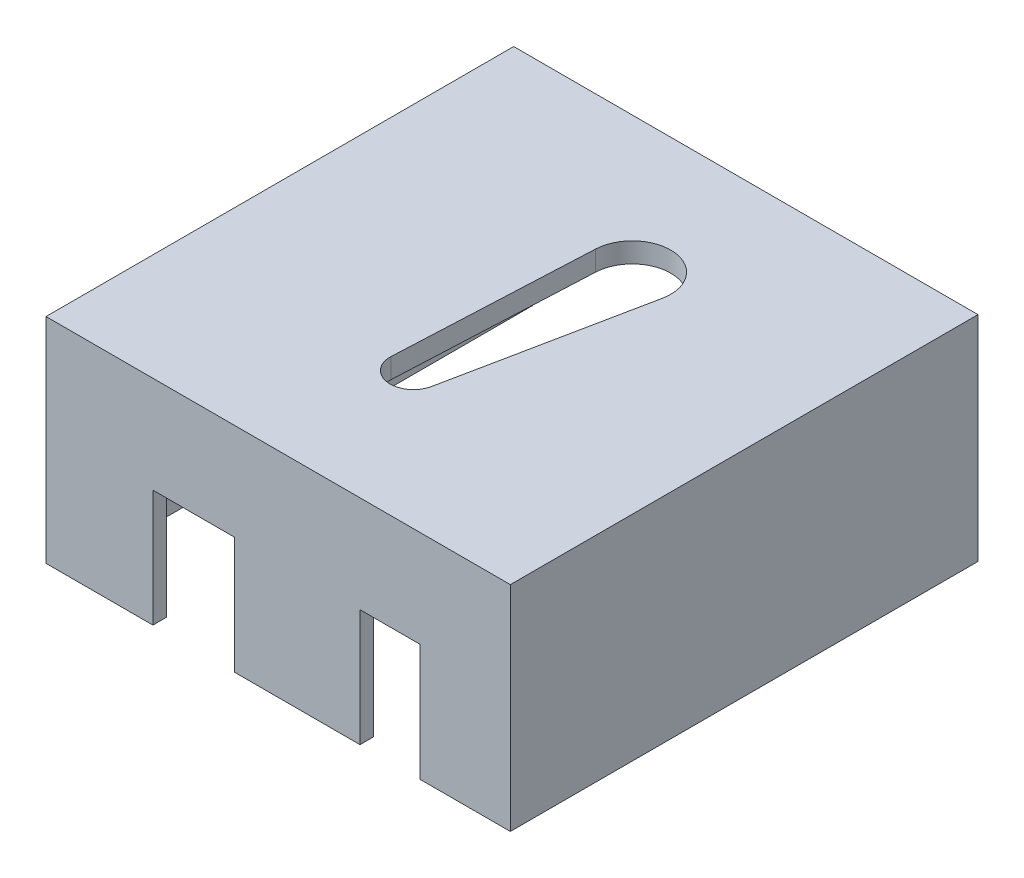
ISO-10303-21;
HEADER;
FILE_DESCRIPTION(('STEP AP214'),'2;1');
FILE_NAME('part.step','',(''),(''),'','','');
FILE_SCHEMA(('AUTOMOTIVE_DESIGN { 1 0 10303 214 1 1 1 1 }'));
ENDSEC;
DATA;
#1=APPLICATION_CONTEXT('core data for automotive mechanical design processes');
#2=APPLICATION_PROTOCOL_DEFINITION('international standard','automotive_design',2000,#1);
#3=PRODUCT_CONTEXT('',#1,'mechanical');
#4=PRODUCT('Part','Part','',(#3));
#5=PRODUCT_RELATED_PRODUCT_CATEGORY('part','',(#4));
#6=PRODUCT_DEFINITION_FORMATION('','',#4);
#7=PRODUCT_DEFINITION_CONTEXT('part definition',#1,'design');
#8=PRODUCT_DEFINITION('design','',#6,#7);
#9=PRODUCT_DEFINITION_SHAPE('','',#8);
#10=(LENGTH_UNIT() NAMED_UNIT(*) SI_UNIT(.MILLI.,.METRE.));
#11=(NAMED_UNIT(*) PLANE_ANGLE_UNIT() SI_UNIT($,.RADIAN.));
#12=(NAMED_UNIT(*) SI_UNIT($,.STERADIAN.) SOLID_ANGLE_UNIT());
#13=UNCERTAINTY_MEASURE_WITH_UNIT(LENGTH_MEASURE(1.E-05),#10,'distance_accuracy_value','');
#14=(GEOMETRIC_REPRESENTATION_CONTEXT(3) GLOBAL_UNCERTAINTY_ASSIGNED_CONTEXT((#13)) GLOBAL_UNIT_ASSIGNED_CONTEXT((#10,
#11,#12)) REPRESENTATION_CONTEXT('',''));
#15=CARTESIAN_POINT('',(0.,0.,0.));
#16=DIRECTION('',(0.,0.,1.));
#17=DIRECTION('',(1.,0.,0.));
#18=AXIS2_PLACEMENT_3D('',#15,#16,#17);
#19=CARTESIAN_POINT('',(0.,-29.464,0.));
#20=DIRECTION('',(0.,-1.,0.));
#21=DIRECTION('',(0.,0.,-1.));
#22=AXIS2_PLACEMENT_3D('',#19,#20,#21);
#23=PLANE('',#22);
#24=DIRECTION('',(0.,0.,1.));
#25=VECTOR('',#24,1.);
#26=CARTESIAN_POINT('',(-6.604,-29.464,0.));
#27=LINE('',#26,#25);
#28=CARTESIAN_POINT('',(-6.604,-29.464,-2.03200000000001));
#29=VERTEX_POINT('',#28);
#30=CARTESIAN_POINT('',(-6.604,-29.464,0.));
#31=VERTEX_POINT('',#30);
#32=EDGE_CURVE('E11',#29,#31,#27,.T.);
#33=ORIENTED_EDGE('',*,*,#32,.F.);
#34=DIRECTION('',(1.,0.,0.));
#35=VECTOR('',#34,1.);
#36=CARTESIAN_POINT('',(0.,-29.464,-2.032));
#37=LINE('',#36,#35);
#38=CARTESIAN_POINT('',(12.446,-29.464,-2.03200000000001));
#39=VERTEX_POINT('',#38);
#40=EDGE_CURVE('E402',#29,#39,#37,.T.);
#41=ORIENTED_EDGE('',*,*,#40,.T.);
#42=DIRECTION('',(0.,0.,-1.));
#43=VECTOR('',#42,1.);
#44=CARTESIAN_POINT('',(12.446,-29.464,0.));
#45=LINE('',#44,#43);
#46=CARTESIAN_POINT('',(12.446,-29.464,0.));
#47=VERTEX_POINT('',#46);
#48=EDGE_CURVE('E426',#47,#39,#45,.T.);
#49=ORIENTED_EDGE('',*,*,#48,.F.);
#50=DIRECTION('',(1.,0.,0.));
#51=VECTOR('',#50,1.);
#52=CARTESIAN_POINT('',(0.,-29.464,0.));
#53=LINE('',#52,#51);
#54=EDGE_CURVE('E410',#31,#47,#53,.T.);
#55=ORIENTED_EDGE('',*,*,#54,.F.);
#56=EDGE_LOOP('',(#33,#41,#49,#55));
#57=FACE_BOUND('',#56,.T.);
#58=ADVANCED_FACE('F33',(#57),#23,.T.);
#59=DIRECTION('',(0.,0.,1.));
#60=VECTOR('',#59,1.);
#61=CARTESIAN_POINT('',(21.59,-29.464,0.));
#62=LINE('',#61,#60);
#63=CARTESIAN_POINT('',(21.59,-29.464,-2.03200000000001));
#64=VERTEX_POINT('',#63);
#65=CARTESIAN_POINT('',(21.59,-29.464,0.));
#66=VERTEX_POINT('',#65);
#67=EDGE_CURVE('E428',#64,#66,#62,.T.);
#68=ORIENTED_EDGE('',*,*,#67,.F.);
#69=CARTESIAN_POINT('',(32.258,-29.464,-2.032));
#70=VERTEX_POINT('',#69);
#71=EDGE_CURVE('E403',#64,#70,#37,.T.);
#72=ORIENTED_EDGE('',*,*,#71,.T.);
#73=DIRECTION('',(0.,0.,1.));
#74=VECTOR('',#73,1.);
#75=CARTESIAN_POINT('',(32.258,-29.464,-71.12));
#76=LINE('',#75,#74);
#77=CARTESIAN_POINT('',(32.258,-29.464,-71.12));
#78=VERTEX_POINT('',#77);
#79=EDGE_CURVE('E384',#78,#70,#76,.T.);
#80=ORIENTED_EDGE('',*,*,#79,.F.);
#81=DIRECTION('',(-1.,0.,0.));
#82=VECTOR('',#81,1.);
#83=CARTESIAN_POINT('',(35.306,-29.464,-71.12));
#84=LINE('',#83,#82);
#85=CARTESIAN_POINT('',(35.306,-29.464,-71.12));
#86=VERTEX_POINT('',#85);
#87=EDGE_CURVE('E381',#86,#78,#84,.T.);
#88=ORIENTED_EDGE('',*,*,#87,.F.);
#89=DIRECTION('',(0.,0.,-1.));
#90=VECTOR('',#89,1.);
#91=CARTESIAN_POINT('',(35.306,-29.464,0.));
#92=LINE('',#91,#90);
#93=CARTESIAN_POINT('',(35.306,-29.464,0.));
#94=VERTEX_POINT('',#93);
#95=EDGE_CURVE('E401',#94,#86,#92,.T.);
#96=ORIENTED_EDGE('',*,*,#95,.F.);
#97=EDGE_CURVE('E406',#66,#94,#53,.T.);
#98=ORIENTED_EDGE('',*,*,#97,.F.);
#99=EDGE_LOOP('',(#68,#72,#80,#88,#96,#98));
#100=FACE_BOUND('',#99,.T.);
#101=ADVANCED_FACE('F490',(#100),#23,.T.);
#102=CARTESIAN_POINT('',(0.,3.048,-71.12));
#103=DIRECTION('',(0.,0.,-1.));
#104=DIRECTION('',(-1.,0.,0.));
#105=AXIS2_PLACEMENT_3D('',#102,#103,#104);
#106=PLANE('',#105);
#107=DIRECTION('',(0.,-1.,0.));
#108=VECTOR('',#107,1.);
#109=CARTESIAN_POINT('',(-33.274,-9.906,-71.12));
#110=LINE('',#109,#108);
#111=CARTESIAN_POINT('',(-33.274,-9.906,-71.12));
#112=VERTEX_POINT('',#111);
#113=CARTESIAN_POINT('',(-33.274,-11.811,-71.12));
#114=VERTEX_POINT('',#113);
#115=EDGE_CURVE('E311',#112,#114,#110,.T.);
#116=ORIENTED_EDGE('',*,*,#115,.T.);
#117=DIRECTION('',(1.,0.,0.));
#118=VECTOR('',#117,1.);
#119=CARTESIAN_POINT('',(-33.274,-11.811,-71.12));
#120=LINE('',#119,#118);
#121=CARTESIAN_POINT('',(-32.258,-11.811,-71.12));
#122=VERTEX_POINT('',#121);
#123=EDGE_CURVE('E301',#114,#122,#120,.T.);
#124=ORIENTED_EDGE('',*,*,#123,.T.);
#125=DIRECTION('',(0.,1.,0.));
#126=VECTOR('',#125,1.);
#127=CARTESIAN_POINT('',(-32.258,-29.464,-71.12));
#128=LINE('',#127,#126);
#129=CARTESIAN_POINT('',(-32.258,-29.464,-71.12));
#130=VERTEX_POINT('',#129);
#131=EDGE_CURVE('E336',#130,#122,#128,.T.);
#132=ORIENTED_EDGE('',*,*,#131,.F.);
#133=DIRECTION('',(1.,0.,0.));
#134=VECTOR('',#133,1.);
#135=CARTESIAN_POINT('',(-35.306,-29.464,-71.12));
#136=LINE('',#135,#134);
#137=CARTESIAN_POINT('',(-35.306,-29.464,-71.12));
#138=VERTEX_POINT('',#137);
#139=EDGE_CURVE('E327',#138,#130,#136,.T.);
#140=ORIENTED_EDGE('',*,*,#139,.F.);
#141=DIRECTION('',(0.,-1.,0.));
#142=VECTOR('',#141,1.);
#143=CARTESIAN_POINT('',(-35.306,3.048,-71.12));
#144=LINE('',#143,#142);
#145=CARTESIAN_POINT('',(-35.306,3.048,-71.12));
#146=VERTEX_POINT('',#145);
#147=EDGE_CURVE('E351',#146,#138,#144,.T.);
#148=ORIENTED_EDGE('',*,*,#147,.F.);
#149=DIRECTION('',(1.,0.,0.));
#150=VECTOR('',#149,1.);
#151=CARTESIAN_POINT('',(0.,3.048,-71.12));
#152=LINE('',#151,#150);
#153=CARTESIAN_POINT('',(35.306,3.048,-71.12));
#154=VERTEX_POINT('',#153);
#155=EDGE_CURVE('E417',#146,#154,#152,.T.);
#156=ORIENTED_EDGE('',*,*,#155,.T.);
#157=DIRECTION('',(0.,-1.,0.));
#158=VECTOR('',#157,1.);
#159=CARTESIAN_POINT('',(35.306,3.048,-71.12));
#160=LINE('',#159,#158);
#161=EDGE_CURVE('E420',#154,#86,#160,.T.);
#162=ORIENTED_EDGE('',*,*,#161,.T.);
#163=ORIENTED_EDGE('',*,*,#87,.T.);
#164=DIRECTION('',(0.,1.,0.));
#165=VECTOR('',#164,1.);
#166=CARTESIAN_POINT('',(32.258,-29.464,-71.12));
#167=LINE('',#166,#165);
#168=CARTESIAN_POINT('',(32.258,-11.811,-71.12));
#169=VERTEX_POINT('',#168);
#170=EDGE_CURVE('E395',#78,#169,#167,.T.);
#171=ORIENTED_EDGE('',*,*,#170,.T.);
#172=DIRECTION('',(-1.,0.,0.));
#173=VECTOR('',#172,1.);
#174=CARTESIAN_POINT('',(33.274,-11.811,-71.12));
#175=LINE('',#174,#173);
#176=CARTESIAN_POINT('',(33.274,-11.811,-71.12));
#177=VERTEX_POINT('',#176);
#178=EDGE_CURVE('E359',#177,#169,#175,.T.);
#179=ORIENTED_EDGE('',*,*,#178,.F.);
#180=DIRECTION('',(0.,-1.,0.));
#181=VECTOR('',#180,1.);
#182=CARTESIAN_POINT('',(33.274,-9.906,-71.12));
#183=LINE('',#182,#181);
#184=CARTESIAN_POINT('',(33.274,-9.906,-71.12));
#185=VERTEX_POINT('',#184);
#186=EDGE_CURVE('E354',#185,#177,#183,.T.);
#187=ORIENTED_EDGE('',*,*,#186,.F.);
#188=DIRECTION('',(1.,0.,0.));
#189=VECTOR('',#188,1.);
#190=CARTESIAN_POINT('',(33.274,-9.906,-71.12));
#191=LINE('',#190,#189);
#192=CARTESIAN_POINT('',(32.258,-9.906,-71.12));
#193=VERTEX_POINT('',#192);
#194=EDGE_CURVE('E355',#193,#185,#191,.T.);
#195=ORIENTED_EDGE('',*,*,#194,.F.);
#196=CARTESIAN_POINT('',(32.258,0.,-71.12));
#197=VERTEX_POINT('',#196);
#198=EDGE_CURVE('E387',#193,#197,#167,.T.);
#199=ORIENTED_EDGE('',*,*,#198,.T.);
#200=DIRECTION('',(1.,0.,0.));
#201=VECTOR('',#200,1.);
#202=CARTESIAN_POINT('',(0.,0.,-71.12));
#203=LINE('',#202,#201);
#204=CARTESIAN_POINT('',(-32.258,0.,-71.12));
#205=VERTEX_POINT('',#204);
#206=EDGE_CURVE('E409',#205,#197,#203,.T.);
#207=ORIENTED_EDGE('',*,*,#206,.F.);
#208=CARTESIAN_POINT('',(-32.258,-9.906,-71.12));
#209=VERTEX_POINT('',#208);
#210=EDGE_CURVE('E340',#209,#205,#128,.T.);
#211=ORIENTED_EDGE('',*,*,#210,.F.);
#212=DIRECTION('',(-1.,0.,0.));
#213=VECTOR('',#212,1.);
#214=CARTESIAN_POINT('',(-33.274,-9.906,-71.12));
#215=LINE('',#214,#213);
#216=EDGE_CURVE('E306',#209,#112,#215,.T.);
#217=ORIENTED_EDGE('',*,*,#216,.T.);
#218=EDGE_LOOP('',(#116,#124,#132,#140,#148,#156,#162,#163,#171,#179,#187,#195,#199,#207,#211,#217));
#219=FACE_BOUND('',#218,.T.);
#220=ADVANCED_FACE('F465',(#219),#106,.T.);
#221=CARTESIAN_POINT('',(-32.258,-29.464,-71.12));
#222=DIRECTION('',(-1.,0.,0.));
#223=DIRECTION('',(0.,0.,1.));
#224=AXIS2_PLACEMENT_3D('',#221,#222,#223);
#225=PLANE('',#224);
#226=DIRECTION('',(0.,0.,-1.));
#227=VECTOR('',#226,1.);
#228=CARTESIAN_POINT('',(-32.258,-11.811,0.126999999999988));
#229=LINE('',#228,#227);
#230=CARTESIAN_POINT('',(-32.258,-11.811,-2.032));
#231=VERTEX_POINT('',#230);
#232=EDGE_CURVE('E304',#231,#122,#229,.T.);
#233=ORIENTED_EDGE('',*,*,#232,.F.);
#234=DIRECTION('',(0.,1.,0.));
#235=VECTOR('',#234,1.);
#236=CARTESIAN_POINT('',(-32.258,-29.464,-2.032));
#237=LINE('',#236,#235);
#238=CARTESIAN_POINT('',(-32.258,-29.464,-2.032));
#239=VERTEX_POINT('',#238);
#240=EDGE_CURVE('E341',#239,#231,#237,.T.);
#241=ORIENTED_EDGE('',*,*,#240,.F.);
#242=DIRECTION('',(0.,0.,1.));
#243=VECTOR('',#242,1.);
#244=CARTESIAN_POINT('',(-32.258,-29.464,-71.12));
#245=LINE('',#244,#243);
#246=EDGE_CURVE('E330',#130,#239,#245,.T.);
#247=ORIENTED_EDGE('',*,*,#246,.F.);
#248=ORIENTED_EDGE('',*,*,#131,.T.);
#249=EDGE_LOOP('',(#233,#241,#247,#248));
#250=FACE_BOUND('',#249,.T.);
#251=ADVANCED_FACE('F440',(#250),#225,.F.);
#252=DIRECTION('',(0.,0.,-1.));
#253=VECTOR('',#252,1.);
#254=CARTESIAN_POINT('',(-32.258,-9.906,0.126999999999988));
#255=LINE('',#254,#253);
#256=CARTESIAN_POINT('',(-32.258,-9.906,-2.032));
#257=VERTEX_POINT('',#256);
#258=EDGE_CURVE('E310',#257,#209,#255,.T.);
#259=ORIENTED_EDGE('',*,*,#258,.T.);
#260=ORIENTED_EDGE('',*,*,#210,.T.);
#261=DIRECTION('',(0.,0.,1.));
#262=VECTOR('',#261,1.);
#263=CARTESIAN_POINT('',(-32.258,0.,-71.12));
#264=LINE('',#263,#262);
#265=CARTESIAN_POINT('',(-32.258,0.,-2.032));
#266=VERTEX_POINT('',#265);
#267=EDGE_CURVE('E316',#205,#266,#264,.T.);
#268=ORIENTED_EDGE('',*,*,#267,.T.);
#269=EDGE_CURVE('E333',#257,#266,#237,.T.);
#270=ORIENTED_EDGE('',*,*,#269,.F.);
#271=EDGE_LOOP('',(#259,#260,#268,#270));
#272=FACE_BOUND('',#271,.T.);
#273=ADVANCED_FACE('F462',(#272),#225,.F.);
#274=CARTESIAN_POINT('',(0.,0.,0.));
#275=DIRECTION('',(0.,1.,0.));
#276=DIRECTION('',(0.,0.,1.));
#277=AXIS2_PLACEMENT_3D('',#274,#275,#276);
#278=PLANE('',#277);
#279=DIRECTION('',(-0.0470723305573422,0.,0.998891483443472));
#280=VECTOR('',#279,1.);
#281=CARTESIAN_POINT('',(-4.78483098710549,0.,-0.225483097632987));
#282=LINE('',#281,#280);
#283=CARTESIAN_POINT('',(-2.40652404627676,0.,-50.693996555116));
#284=VERTEX_POINT('',#283);
#285=CARTESIAN_POINT('',(-3.80605811512499,0.,-20.9953892074619));
#286=VERTEX_POINT('',#285);
#287=EDGE_CURVE('E294',#284,#286,#282,.T.);
#288=ORIENTED_EDGE('',*,*,#287,.T.);
#289=CARTESIAN_POINT('',(-0.254,0.,-20.828));
#290=DIRECTION('',(0.,1.,0.));
#291=DIRECTION('',(0.,0.,1.));
#292=AXIS2_PLACEMENT_3D('',#289,#290,#291);
#293=CIRCLE('',#292,3.556);
#294=CARTESIAN_POINT('',(3.23071793736333,0.,-20.1195672953496));
#295=VERTEX_POINT('',#294);
#296=EDGE_CURVE('E297',#286,#295,#293,.T.);
#297=ORIENTED_EDGE('',*,*,#296,.T.);
#298=DIRECTION('',(0.199221795458485,0.,-0.97995442558024));
#299=VECTOR('',#298,1.);
#300=CARTESIAN_POINT('',(-0.825415592975718,0.,-0.167804514311659));
#301=LINE('',#300,#299);
#302=CARTESIAN_POINT('',(9.15389375423977,0.,-49.2551462709315));
#303=VERTEX_POINT('',#302);
#304=EDGE_CURVE('E282',#295,#303,#301,.T.);
#305=ORIENTED_EDGE('',*,*,#304,.T.);
#306=CARTESIAN_POINT('',(3.42900000000001,0.,-50.419));
#307=DIRECTION('',(0.,1.,0.));
#308=DIRECTION('',(0.,0.,1.));
#309=AXIS2_PLACEMENT_3D('',#306,#307,#308);
#310=CIRCLE('',#309,5.842);
#311=EDGE_CURVE('E291',#303,#284,#310,.T.);
#312=ORIENTED_EDGE('',*,*,#311,.T.);
#313=EDGE_LOOP('',(#288,#297,#305,#312));
#314=FACE_BOUND('',#313,.T.);
#315=ORIENTED_EDGE('',*,*,#267,.F.);
#316=ORIENTED_EDGE('',*,*,#206,.T.);
#317=DIRECTION('',(0.,0.,1.));
#318=VECTOR('',#317,1.);
#319=CARTESIAN_POINT('',(32.258,0.,-71.12));
#320=LINE('',#319,#318);
#321=CARTESIAN_POINT('',(32.258,0.,-2.032));
#322=VERTEX_POINT('',#321);
#323=EDGE_CURVE('E380',#197,#322,#320,.T.);
#324=ORIENTED_EDGE('',*,*,#323,.T.);
#325=DIRECTION('',(1.,0.,0.));
#326=VECTOR('',#325,1.);
#327=CARTESIAN_POINT('',(0.,0.,-2.032));
#328=LINE('',#327,#326);
#329=EDGE_CURVE('E393',#266,#322,#328,.T.);
#330=ORIENTED_EDGE('',*,*,#329,.F.);
#331=EDGE_LOOP('',(#315,#316,#324,#330));
#332=FACE_BOUND('',#331,.T.);
#333=ADVANCED_FACE('F459',(#314,#332),#278,.F.);
#334=CARTESIAN_POINT('',(0.,-29.464,-2.032));
#335=DIRECTION('',(0.,0.,1.));
#336=DIRECTION('',(1.,0.,0.));
#337=AXIS2_PLACEMENT_3D('',#334,#335,#336);
#338=PLANE('',#337);
#339=ORIENTED_EDGE('',*,*,#40,.F.);
#340=DIRECTION('',(0.,1.,0.));
#341=VECTOR('',#340,1.);
#342=CARTESIAN_POINT('',(-6.604,-29.464,-2.032));
#343=LINE('',#342,#341);
#344=CARTESIAN_POINT('',(-6.604,-11.684,-2.03200000000001));
#345=VERTEX_POINT('',#344);
#346=EDGE_CURVE('E262',#29,#345,#343,.T.);
#347=ORIENTED_EDGE('',*,*,#346,.T.);
#348=DIRECTION('',(-1.,0.,0.));
#349=VECTOR('',#348,1.);
#350=CARTESIAN_POINT('',(0.,-11.684,-2.032));
#351=LINE('',#350,#349);
#352=CARTESIAN_POINT('',(-19.05,-11.684,-2.03200000000001));
#353=VERTEX_POINT('',#352);
#354=EDGE_CURVE('E224',#345,#353,#351,.T.);
#355=ORIENTED_EDGE('',*,*,#354,.T.);
#356=DIRECTION('',(0.,-1.,0.));
#357=VECTOR('',#356,1.);
#358=CARTESIAN_POINT('',(-19.05,-29.464,-2.032));
#359=LINE('',#358,#357);
#360=CARTESIAN_POINT('',(-19.05,-29.464,-2.03200000000001));
#361=VERTEX_POINT('',#360);
#362=EDGE_CURVE('E259',#353,#361,#359,.T.);
#363=ORIENTED_EDGE('',*,*,#362,.T.);
#364=EDGE_CURVE('E398',#239,#361,#37,.T.);
#365=ORIENTED_EDGE('',*,*,#364,.F.);
#366=ORIENTED_EDGE('',*,*,#240,.T.);
#367=DIRECTION('',(1.,0.,0.));
#368=VECTOR('',#367,1.);
#369=CARTESIAN_POINT('',(-33.274,-11.811,-2.032));
#370=LINE('',#369,#368);
#371=CARTESIAN_POINT('',(-33.274,-11.811,-2.032));
#372=VERTEX_POINT('',#371);
#373=EDGE_CURVE('E314',#372,#231,#370,.T.);
#374=ORIENTED_EDGE('',*,*,#373,.F.);
#375=DIRECTION('',(0.,-1.,0.));
#376=VECTOR('',#375,1.);
#377=CARTESIAN_POINT('',(-33.274,-9.906,-2.032));
#378=LINE('',#377,#376);
#379=CARTESIAN_POINT('',(-33.274,-9.906,-2.032));
#380=VERTEX_POINT('',#379);
#381=EDGE_CURVE('E317',#380,#372,#378,.T.);
#382=ORIENTED_EDGE('',*,*,#381,.F.);
#383=DIRECTION('',(-1.,0.,0.));
#384=VECTOR('',#383,1.);
#385=CARTESIAN_POINT('',(-33.274,-9.906,-2.032));
#386=LINE('',#385,#384);
#387=EDGE_CURVE('E309',#257,#380,#386,.T.);
#388=ORIENTED_EDGE('',*,*,#387,.F.);
#389=ORIENTED_EDGE('',*,*,#269,.T.);
#390=ORIENTED_EDGE('',*,*,#329,.T.);
#391=DIRECTION('',(0.,1.,0.));
#392=VECTOR('',#391,1.);
#393=CARTESIAN_POINT('',(32.258,-29.464,-2.032));
#394=LINE('',#393,#392);
#395=CARTESIAN_POINT('',(32.258,-9.906,-2.032));
#396=VERTEX_POINT('',#395);
#397=EDGE_CURVE('E394',#396,#322,#394,.T.);
#398=ORIENTED_EDGE('',*,*,#397,.F.);
#399=DIRECTION('',(1.,0.,0.));
#400=VECTOR('',#399,1.);
#401=CARTESIAN_POINT('',(33.274,-9.906,-2.032));
#402=LINE('',#401,#400);
#403=CARTESIAN_POINT('',(33.274,-9.906,-2.032));
#404=VERTEX_POINT('',#403);
#405=EDGE_CURVE('E371',#396,#404,#402,.T.);
#406=ORIENTED_EDGE('',*,*,#405,.T.);
#407=DIRECTION('',(0.,-1.,0.));
#408=VECTOR('',#407,1.);
#409=CARTESIAN_POINT('',(33.274,-9.906,-2.032));
#410=LINE('',#409,#408);
#411=CARTESIAN_POINT('',(33.274,-11.811,-2.032));
#412=VERTEX_POINT('',#411);
#413=EDGE_CURVE('E366',#404,#412,#410,.T.);
#414=ORIENTED_EDGE('',*,*,#413,.T.);
#415=DIRECTION('',(-1.,0.,0.));
#416=VECTOR('',#415,1.);
#417=CARTESIAN_POINT('',(33.274,-11.811,-2.032));
#418=LINE('',#417,#416);
#419=CARTESIAN_POINT('',(32.258,-11.811,-2.032));
#420=VERTEX_POINT('',#419);
#421=EDGE_CURVE('E358',#412,#420,#418,.T.);
#422=ORIENTED_EDGE('',*,*,#421,.T.);
#423=EDGE_CURVE('E390',#70,#420,#394,.T.);
#424=ORIENTED_EDGE('',*,*,#423,.F.);
#425=ORIENTED_EDGE('',*,*,#71,.F.);
#426=DIRECTION('',(0.,1.,0.));
#427=VECTOR('',#426,1.);
#428=CARTESIAN_POINT('',(21.59,-29.464,-2.032));
#429=LINE('',#428,#427);
#430=CARTESIAN_POINT('',(21.59,-11.684,-2.03200000000001));
#431=VERTEX_POINT('',#430);
#432=EDGE_CURVE('E256',#64,#431,#429,.T.);
#433=ORIENTED_EDGE('',*,*,#432,.T.);
#434=DIRECTION('',(-1.,0.,0.));
#435=VECTOR('',#434,1.);
#436=CARTESIAN_POINT('',(0.,-11.684,-2.032));
#437=LINE('',#436,#435);
#438=CARTESIAN_POINT('',(12.446,-11.684,-2.03200000000001));
#439=VERTEX_POINT('',#438);
#440=EDGE_CURVE('E264',#431,#439,#437,.T.);
#441=ORIENTED_EDGE('',*,*,#440,.T.);
#442=DIRECTION('',(0.,-1.,0.));
#443=VECTOR('',#442,1.);
#444=CARTESIAN_POINT('',(12.446,-29.464,-2.032));
#445=LINE('',#444,#443);
#446=EDGE_CURVE('E242',#439,#39,#445,.T.);
#447=ORIENTED_EDGE('',*,*,#446,.T.);
#448=EDGE_LOOP('',(#339,#347,#355,#363,#365,#366,#374,#382,#388,#389,#390,#398,#406,#414,#422,
#424,#425,#433,#441,#447));
#449=FACE_BOUND('',#448,.T.);
#450=ADVANCED_FACE('F433',(#449),#338,.F.);
#451=CARTESIAN_POINT('',(32.258,-29.464,-71.12));
#452=DIRECTION('',(-1.,0.,0.));
#453=DIRECTION('',(0.,0.,1.));
#454=AXIS2_PLACEMENT_3D('',#451,#452,#453);
#455=PLANE('',#454);
#456=DIRECTION('',(0.,0.,-1.));
#457=VECTOR('',#456,1.);
#458=CARTESIAN_POINT('',(32.258,-11.811,0.126999999999988));
#459=LINE('',#458,#457);
#460=EDGE_CURVE('E365',#420,#169,#459,.T.);
#461=ORIENTED_EDGE('',*,*,#460,.T.);
#462=ORIENTED_EDGE('',*,*,#170,.F.);
#463=ORIENTED_EDGE('',*,*,#79,.T.);
#464=ORIENTED_EDGE('',*,*,#423,.T.);
#465=EDGE_LOOP('',(#461,#462,#463,#464));
#466=FACE_BOUND('',#465,.T.);
#467=ADVANCED_FACE('F485',(#466),#455,.T.);
#468=CARTESIAN_POINT('',(0.,3.048,0.));
#469=DIRECTION('',(0.,0.,-1.));
#470=DIRECTION('',(-1.,0.,0.));
#471=AXIS2_PLACEMENT_3D('',#468,#469,#470);
#472=PLANE('',#471);
#473=DIRECTION('',(-1.,0.,0.));
#474=VECTOR('',#473,1.);
#475=CARTESIAN_POINT('',(-6.604,-11.684,0.));
#476=LINE('',#475,#474);
#477=CARTESIAN_POINT('',(-6.604,-11.684,0.));
#478=VERTEX_POINT('',#477);
#479=CARTESIAN_POINT('',(-19.05,-11.684,0.));
#480=VERTEX_POINT('',#479);
#481=EDGE_CURVE('E222',#478,#480,#476,.T.);
#482=ORIENTED_EDGE('',*,*,#481,.F.);
#483=DIRECTION('',(0.,1.,0.));
#484=VECTOR('',#483,1.);
#485=CARTESIAN_POINT('',(-6.604,-29.464,0.));
#486=LINE('',#485,#484);
#487=EDGE_CURVE('E230',#31,#478,#486,.T.);
#488=ORIENTED_EDGE('',*,*,#487,.F.);
#489=ORIENTED_EDGE('',*,*,#54,.T.);
#490=DIRECTION('',(0.,-1.,0.));
#491=VECTOR('',#490,1.);
#492=CARTESIAN_POINT('',(12.446,-29.464,0.));
#493=LINE('',#492,#491);
#494=CARTESIAN_POINT('',(12.446,-11.684,0.));
#495=VERTEX_POINT('',#494);
#496=EDGE_CURVE('E48',#495,#47,#493,.T.);
#497=ORIENTED_EDGE('',*,*,#496,.F.);
#498=DIRECTION('',(-1.,0.,0.));
#499=VECTOR('',#498,1.);
#500=CARTESIAN_POINT('',(21.59,-11.684,0.));
#501=LINE('',#500,#499);
#502=CARTESIAN_POINT('',(21.59,-11.684,0.));
#503=VERTEX_POINT('',#502);
#504=EDGE_CURVE('E247',#503,#495,#501,.T.);
#505=ORIENTED_EDGE('',*,*,#504,.F.);
#506=DIRECTION('',(0.,1.,0.));
#507=VECTOR('',#506,1.);
#508=CARTESIAN_POINT('',(21.59,-29.464,0.));
#509=LINE('',#508,#507);
#510=EDGE_CURVE('E244',#66,#503,#509,.T.);
#511=ORIENTED_EDGE('',*,*,#510,.F.);
#512=ORIENTED_EDGE('',*,*,#97,.T.);
#513=DIRECTION('',(0.,-1.,0.));
#514=VECTOR('',#513,1.);
#515=CARTESIAN_POINT('',(35.306,3.048,0.));
#516=LINE('',#515,#514);
#517=CARTESIAN_POINT('',(35.306,3.048,0.));
#518=VERTEX_POINT('',#517);
#519=EDGE_CURVE('E423',#518,#94,#516,.T.);
#520=ORIENTED_EDGE('',*,*,#519,.F.);
#521=DIRECTION('',(1.,0.,0.));
#522=VECTOR('',#521,1.);
#523=CARTESIAN_POINT('',(0.,3.048,0.));
#524=LINE('',#523,#522);
#525=CARTESIAN_POINT('',(-35.306,3.048,0.));
#526=VERTEX_POINT('',#525);
#527=EDGE_CURVE('E412',#526,#518,#524,.T.);
#528=ORIENTED_EDGE('',*,*,#527,.F.);
#529=DIRECTION('',(0.,-1.,0.));
#530=VECTOR('',#529,1.);
#531=CARTESIAN_POINT('',(-35.306,3.048,0.));
#532=LINE('',#531,#530);
#533=CARTESIAN_POINT('',(-35.306,-29.464,0.));
#534=VERTEX_POINT('',#533);
#535=EDGE_CURVE('E348',#526,#534,#532,.T.);
#536=ORIENTED_EDGE('',*,*,#535,.T.);
#537=CARTESIAN_POINT('',(-19.05,-29.464,0.));
#538=VERTEX_POINT('',#537);
#539=EDGE_CURVE('E407',#534,#538,#53,.T.);
#540=ORIENTED_EDGE('',*,*,#539,.T.);
#541=DIRECTION('',(0.,-1.,0.));
#542=VECTOR('',#541,1.);
#543=CARTESIAN_POINT('',(-19.05,-29.464,0.));
#544=LINE('',#543,#542);
#545=EDGE_CURVE('E56',#480,#538,#544,.T.);
#546=ORIENTED_EDGE('',*,*,#545,.F.);
#547=EDGE_LOOP('',(#482,#488,#489,#497,#505,#511,#512,#520,#528,#536,#540,#546));
#548=FACE_BOUND('',#547,.T.);
#549=ADVANCED_FACE('F35',(#548),#472,.F.);
#550=CARTESIAN_POINT('',(35.306,3.048,0.));
#551=DIRECTION('',(-1.,0.,0.));
#552=DIRECTION('',(0.,0.,1.));
#553=AXIS2_PLACEMENT_3D('',#550,#551,#552);
#554=PLANE('',#553);
#555=ORIENTED_EDGE('',*,*,#95,.T.);
#556=ORIENTED_EDGE('',*,*,#161,.F.);
#557=DIRECTION('',(0.,0.,-1.));
#558=VECTOR('',#557,1.);
#559=CARTESIAN_POINT('',(35.306,3.048,0.));
#560=LINE('',#559,#558);
#561=EDGE_CURVE('E415',#518,#154,#560,.T.);
#562=ORIENTED_EDGE('',*,*,#561,.F.);
#563=ORIENTED_EDGE('',*,*,#519,.T.);
#564=EDGE_LOOP('',(#555,#556,#562,#563));
#565=FACE_BOUND('',#564,.T.);
#566=ADVANCED_FACE('F495',(#565),#554,.F.);
#567=CARTESIAN_POINT('',(0.,3.048,0.));
#568=DIRECTION('',(0.,1.,0.));
#569=DIRECTION('',(0.,0.,1.));
#570=AXIS2_PLACEMENT_3D('',#567,#568,#569);
#571=PLANE('',#570);
#572=CARTESIAN_POINT('',(-0.254,3.048,-20.828));
#573=DIRECTION('',(0.,1.,0.));
#574=DIRECTION('',(0.,0.,1.));
#575=AXIS2_PLACEMENT_3D('',#572,#573,#574);
#576=CIRCLE('',#575,3.556);
#577=CARTESIAN_POINT('',(-3.80605811512499,3.048,-20.9953892074619));
#578=VERTEX_POINT('',#577);
#579=CARTESIAN_POINT('',(3.23071793736333,3.048,-20.1195672953496));
#580=VERTEX_POINT('',#579);
#581=EDGE_CURVE('E268',#578,#580,#576,.T.);
#582=ORIENTED_EDGE('',*,*,#581,.F.);
#583=DIRECTION('',(-0.0470723305573422,0.,0.998891483443472));
#584=VECTOR('',#583,1.);
#585=CARTESIAN_POINT('',(-3.80605811512499,3.048,-20.9953892074619));
#586=LINE('',#585,#584);
#587=CARTESIAN_POINT('',(-2.40652404627676,3.048,-50.693996555116));
#588=VERTEX_POINT('',#587);
#589=EDGE_CURVE('E276',#588,#578,#586,.T.);
#590=ORIENTED_EDGE('',*,*,#589,.F.);
#591=CARTESIAN_POINT('',(3.42900000000001,3.048,-50.419));
#592=DIRECTION('',(0.,1.,0.));
#593=DIRECTION('',(0.,0.,-1.));
#594=AXIS2_PLACEMENT_3D('',#591,#592,#593);
#595=CIRCLE('',#594,5.842);
#596=CARTESIAN_POINT('',(9.15389375423976,3.048,-49.2551462709315));
#597=VERTEX_POINT('',#596);
#598=EDGE_CURVE('E273',#597,#588,#595,.T.);
#599=ORIENTED_EDGE('',*,*,#598,.F.);
#600=DIRECTION('',(0.199221795458485,0.,-0.97995442558024));
#601=VECTOR('',#600,1.);
#602=CARTESIAN_POINT('',(3.23071793736333,3.048,-20.1195672953496));
#603=LINE('',#602,#601);
#604=EDGE_CURVE('E270',#580,#597,#603,.T.);
#605=ORIENTED_EDGE('',*,*,#604,.F.);
#606=EDGE_LOOP('',(#582,#590,#599,#605));
#607=FACE_BOUND('',#606,.T.);
#608=ORIENTED_EDGE('',*,*,#527,.T.);
#609=ORIENTED_EDGE('',*,*,#561,.T.);
#610=ORIENTED_EDGE('',*,*,#155,.F.);
#611=DIRECTION('',(0.,0.,-1.));
#612=VECTOR('',#611,1.);
#613=CARTESIAN_POINT('',(-35.306,3.048,0.));
#614=LINE('',#613,#612);
#615=EDGE_CURVE('E345',#526,#146,#614,.T.);
#616=ORIENTED_EDGE('',*,*,#615,.F.);
#617=EDGE_LOOP('',(#608,#609,#610,#616));
#618=FACE_BOUND('',#617,.T.);
#619=ADVANCED_FACE('F528',(#607,#618),#571,.T.);
#620=DIRECTION('',(0.,0.,-1.));
#621=VECTOR('',#620,1.);
#622=CARTESIAN_POINT('',(-19.05,-29.464,0.));
#623=LINE('',#622,#621);
#624=EDGE_CURVE('E41',#538,#361,#623,.T.);
#625=ORIENTED_EDGE('',*,*,#624,.F.);
#626=ORIENTED_EDGE('',*,*,#539,.F.);
#627=DIRECTION('',(0.,0.,-1.));
#628=VECTOR('',#627,1.);
#629=CARTESIAN_POINT('',(-35.306,-29.464,0.));
#630=LINE('',#629,#628);
#631=EDGE_CURVE('E339',#534,#138,#630,.T.);
#632=ORIENTED_EDGE('',*,*,#631,.T.);
#633=ORIENTED_EDGE('',*,*,#139,.T.);
#634=ORIENTED_EDGE('',*,*,#246,.T.);
#635=ORIENTED_EDGE('',*,*,#364,.T.);
#636=EDGE_LOOP('',(#625,#626,#632,#633,#634,#635));
#637=FACE_BOUND('',#636,.T.);
#638=ADVANCED_FACE('F434',(#637),#23,.T.);
#639=DIRECTION('',(0.,0.,-1.));
#640=VECTOR('',#639,1.);
#641=CARTESIAN_POINT('',(32.258,-9.906,0.126999999999988));
#642=LINE('',#641,#640);
#643=EDGE_CURVE('E374',#396,#193,#642,.T.);
#644=ORIENTED_EDGE('',*,*,#643,.F.);
#645=ORIENTED_EDGE('',*,*,#397,.T.);
#646=ORIENTED_EDGE('',*,*,#323,.F.);
#647=ORIENTED_EDGE('',*,*,#198,.F.);
#648=EDGE_LOOP('',(#644,#645,#646,#647));
#649=FACE_BOUND('',#648,.T.);
#650=ADVANCED_FACE('F472',(#649),#455,.T.);
#651=CARTESIAN_POINT('',(33.274,-11.811,0.126999999999988));
#652=DIRECTION('',(0.,-1.,0.));
#653=DIRECTION('',(0.,0.,-1.));
#654=AXIS2_PLACEMENT_3D('',#651,#652,#653);
#655=PLANE('',#654);
#656=DIRECTION('',(0.,0.,-1.));
#657=VECTOR('',#656,1.);
#658=CARTESIAN_POINT('',(33.274,-11.811,0.126999999999988));
#659=LINE('',#658,#657);
#660=EDGE_CURVE('E369',#412,#177,#659,.T.);
#661=ORIENTED_EDGE('',*,*,#660,.T.);
#662=ORIENTED_EDGE('',*,*,#178,.T.);
#663=ORIENTED_EDGE('',*,*,#460,.F.);
#664=ORIENTED_EDGE('',*,*,#421,.F.);
#665=EDGE_LOOP('',(#661,#662,#663,#664));
#666=FACE_BOUND('',#665,.T.);
#667=ADVANCED_FACE('F481',(#666),#655,.F.);
#668=CARTESIAN_POINT('',(33.274,-9.906,0.126999999999988));
#669=DIRECTION('',(0.,1.,0.));
#670=DIRECTION('',(0.,0.,1.));
#671=AXIS2_PLACEMENT_3D('',#668,#669,#670);
#672=PLANE('',#671);
#673=ORIENTED_EDGE('',*,*,#643,.T.);
#674=ORIENTED_EDGE('',*,*,#194,.T.);
#675=DIRECTION('',(0.,0.,-1.));
#676=VECTOR('',#675,1.);
#677=CARTESIAN_POINT('',(33.274,-9.906,0.126999999999988));
#678=LINE('',#677,#676);
#679=EDGE_CURVE('E370',#404,#185,#678,.T.);
#680=ORIENTED_EDGE('',*,*,#679,.F.);
#681=ORIENTED_EDGE('',*,*,#405,.F.);
#682=EDGE_LOOP('',(#673,#674,#680,#681));
#683=FACE_BOUND('',#682,.T.);
#684=ADVANCED_FACE('F476',(#683),#672,.F.);
#685=CARTESIAN_POINT('',(33.274,-9.906,0.126999999999988));
#686=DIRECTION('',(1.,0.,0.));
#687=DIRECTION('',(0.,0.,-1.));
#688=AXIS2_PLACEMENT_3D('',#685,#686,#687);
#689=PLANE('',#688);
#690=ORIENTED_EDGE('',*,*,#679,.T.);
#691=ORIENTED_EDGE('',*,*,#186,.T.);
#692=ORIENTED_EDGE('',*,*,#660,.F.);
#693=ORIENTED_EDGE('',*,*,#413,.F.);
#694=EDGE_LOOP('',(#690,#691,#692,#693));
#695=FACE_BOUND('',#694,.T.);
#696=ADVANCED_FACE('F478',(#695),#689,.F.);
#697=CARTESIAN_POINT('',(-35.306,3.048,0.));
#698=DIRECTION('',(-1.,0.,0.));
#699=DIRECTION('',(0.,0.,1.));
#700=AXIS2_PLACEMENT_3D('',#697,#698,#699);
#701=PLANE('',#700);
#702=ORIENTED_EDGE('',*,*,#147,.T.);
#703=ORIENTED_EDGE('',*,*,#631,.F.);
#704=ORIENTED_EDGE('',*,*,#535,.F.);
#705=ORIENTED_EDGE('',*,*,#615,.T.);
#706=EDGE_LOOP('',(#702,#703,#704,#705));
#707=FACE_BOUND('',#706,.T.);
#708=ADVANCED_FACE('F558',(#707),#701,.T.);
#709=CARTESIAN_POINT('',(-33.274,-9.906,0.126999999999988));
#710=DIRECTION('',(1.,0.,0.));
#711=DIRECTION('',(0.,0.,-1.));
#712=AXIS2_PLACEMENT_3D('',#709,#710,#711);
#713=PLANE('',#712);
#714=ORIENTED_EDGE('',*,*,#381,.T.);
#715=DIRECTION('',(0.,0.,-1.));
#716=VECTOR('',#715,1.);
#717=CARTESIAN_POINT('',(-33.274,-11.811,0.126999999999988));
#718=LINE('',#717,#716);
#719=EDGE_CURVE('E305',#372,#114,#718,.T.);
#720=ORIENTED_EDGE('',*,*,#719,.T.);
#721=ORIENTED_EDGE('',*,*,#115,.F.);
#722=DIRECTION('',(0.,0.,-1.));
#723=VECTOR('',#722,1.);
#724=CARTESIAN_POINT('',(-33.274,-9.906,0.126999999999988));
#725=LINE('',#724,#723);
#726=EDGE_CURVE('E300',#380,#112,#725,.T.);
#727=ORIENTED_EDGE('',*,*,#726,.F.);
#728=EDGE_LOOP('',(#714,#720,#721,#727));
#729=FACE_BOUND('',#728,.T.);
#730=ADVANCED_FACE('F448',(#729),#713,.T.);
#731=CARTESIAN_POINT('',(-33.274,-11.811,0.126999999999988));
#732=DIRECTION('',(0.,1.,0.));
#733=DIRECTION('',(0.,0.,1.));
#734=AXIS2_PLACEMENT_3D('',#731,#732,#733);
#735=PLANE('',#734);
#736=ORIENTED_EDGE('',*,*,#373,.T.);
#737=ORIENTED_EDGE('',*,*,#232,.T.);
#738=ORIENTED_EDGE('',*,*,#123,.F.);
#739=ORIENTED_EDGE('',*,*,#719,.F.);
#740=EDGE_LOOP('',(#736,#737,#738,#739));
#741=FACE_BOUND('',#740,.T.);
#742=ADVANCED_FACE('F445',(#741),#735,.T.);
#743=CARTESIAN_POINT('',(-33.274,-9.906,0.126999999999988));
#744=DIRECTION('',(0.,-1.,0.));
#745=DIRECTION('',(0.,0.,-1.));
#746=AXIS2_PLACEMENT_3D('',#743,#744,#745);
#747=PLANE('',#746);
#748=ORIENTED_EDGE('',*,*,#387,.T.);
#749=ORIENTED_EDGE('',*,*,#726,.T.);
#750=ORIENTED_EDGE('',*,*,#216,.F.);
#751=ORIENTED_EDGE('',*,*,#258,.F.);
#752=EDGE_LOOP('',(#748,#749,#750,#751));
#753=FACE_BOUND('',#752,.T.);
#754=ADVANCED_FACE('F450',(#753),#747,.T.);
#755=CARTESIAN_POINT('',(-0.254,-29.464,-20.828));
#756=DIRECTION('',(0.,1.,0.));
#757=DIRECTION('',(0.,0.,1.));
#758=AXIS2_PLACEMENT_3D('',#755,#756,#757);
#759=CYLINDRICAL_SURFACE('',#758,3.556);
#760=DIRECTION('',(0.,1.,0.));
#761=VECTOR('',#760,1.);
#762=CARTESIAN_POINT('',(-3.80605811512499,-29.464,-20.9953892074619));
#763=LINE('',#762,#761);
#764=EDGE_CURVE('E280',#286,#578,#763,.T.);
#765=ORIENTED_EDGE('',*,*,#764,.T.);
#766=ORIENTED_EDGE('',*,*,#581,.T.);
#767=DIRECTION('',(0.,1.,0.));
#768=VECTOR('',#767,1.);
#769=CARTESIAN_POINT('',(3.23071793736333,-29.464,-20.1195672953496));
#770=LINE('',#769,#768);
#771=EDGE_CURVE('E279',#295,#580,#770,.T.);
#772=ORIENTED_EDGE('',*,*,#771,.F.);
#773=ORIENTED_EDGE('',*,*,#296,.F.);
#774=EDGE_LOOP('',(#765,#766,#772,#773));
#775=FACE_BOUND('',#774,.T.);
#776=ADVANCED_FACE('F600',(#775),#759,.F.);
#777=CARTESIAN_POINT('',(-3.80605811512499,-29.464,-20.9953892074619));
#778=DIRECTION('',(-0.998891483443472,0.,-0.0470723305573422));
#779=DIRECTION('',(-0.0470723305573422,0.,0.998891483443472));
#780=AXIS2_PLACEMENT_3D('',#777,#778,#779);
#781=PLANE('',#780);
#782=DIRECTION('',(0.,1.,0.));
#783=VECTOR('',#782,1.);
#784=CARTESIAN_POINT('',(-2.40652404627676,-29.464,-50.693996555116));
#785=LINE('',#784,#783);
#786=EDGE_CURVE('E283',#284,#588,#785,.T.);
#787=ORIENTED_EDGE('',*,*,#786,.T.);
#788=ORIENTED_EDGE('',*,*,#589,.T.);
#789=ORIENTED_EDGE('',*,*,#764,.F.);
#790=ORIENTED_EDGE('',*,*,#287,.F.);
#791=EDGE_LOOP('',(#787,#788,#789,#790));
#792=FACE_BOUND('',#791,.T.);
#793=ADVANCED_FACE('F606',(#792),#781,.F.);
#794=CARTESIAN_POINT('',(3.42900000000001,-29.464,-50.419));
#795=DIRECTION('',(0.,1.,0.));
#796=DIRECTION('',(0.,0.,1.));
#797=AXIS2_PLACEMENT_3D('',#794,#795,#796);
#798=CYLINDRICAL_SURFACE('',#797,5.842);
#799=DIRECTION('',(0.,1.,0.));
#800=VECTOR('',#799,1.);
#801=CARTESIAN_POINT('',(9.15389375423976,-29.464,-49.2551462709315));
#802=LINE('',#801,#800);
#803=EDGE_CURVE('E285',#303,#597,#802,.T.);
#804=ORIENTED_EDGE('',*,*,#803,.T.);
#805=ORIENTED_EDGE('',*,*,#598,.T.);
#806=ORIENTED_EDGE('',*,*,#786,.F.);
#807=ORIENTED_EDGE('',*,*,#311,.F.);
#808=EDGE_LOOP('',(#804,#805,#806,#807));
#809=FACE_BOUND('',#808,.T.);
#810=ADVANCED_FACE('F614',(#809),#798,.F.);
#811=CARTESIAN_POINT('',(3.23071793736333,-29.464,-20.1195672953496));
#812=DIRECTION('',(0.97995442558024,0.,0.199221795458485));
#813=DIRECTION('',(0.199221795458485,0.,-0.97995442558024));
#814=AXIS2_PLACEMENT_3D('',#811,#812,#813);
#815=PLANE('',#814);
#816=ORIENTED_EDGE('',*,*,#771,.T.);
#817=ORIENTED_EDGE('',*,*,#604,.T.);
#818=ORIENTED_EDGE('',*,*,#803,.F.);
#819=ORIENTED_EDGE('',*,*,#304,.F.);
#820=EDGE_LOOP('',(#816,#817,#818,#819));
#821=FACE_BOUND('',#820,.T.);
#822=ADVANCED_FACE('F516',(#821),#815,.F.);
#823=CARTESIAN_POINT('',(21.59,-11.684,-71.12));
#824=DIRECTION('',(0.,1.,0.));
#825=DIRECTION('',(-1.,0.,0.));
#826=AXIS2_PLACEMENT_3D('',#823,#824,#825);
#827=PLANE('',#826);
#828=DIRECTION('',(0.,0.,1.));
#829=VECTOR('',#828,1.);
#830=CARTESIAN_POINT('',(21.59,-11.684,-71.12));
#831=LINE('',#830,#829);
#832=EDGE_CURVE('E251',#431,#503,#831,.T.);
#833=ORIENTED_EDGE('',*,*,#832,.T.);
#834=ORIENTED_EDGE('',*,*,#504,.T.);
#835=DIRECTION('',(0.,0.,1.));
#836=VECTOR('',#835,1.);
#837=CARTESIAN_POINT('',(12.446,-11.684,-71.12));
#838=LINE('',#837,#836);
#839=EDGE_CURVE('E236',#439,#495,#838,.T.);
#840=ORIENTED_EDGE('',*,*,#839,.F.);
#841=ORIENTED_EDGE('',*,*,#440,.F.);
#842=EDGE_LOOP('',(#833,#834,#840,#841));
#843=FACE_BOUND('',#842,.T.);
#844=ADVANCED_FACE('F506',(#843),#827,.F.);
#845=CARTESIAN_POINT('',(21.59,-29.464,-71.12));
#846=DIRECTION('',(1.,0.,0.));
#847=DIRECTION('',(0.,0.,-1.));
#848=AXIS2_PLACEMENT_3D('',#845,#846,#847);
#849=PLANE('',#848);
#850=ORIENTED_EDGE('',*,*,#67,.T.);
#851=ORIENTED_EDGE('',*,*,#510,.T.);
#852=ORIENTED_EDGE('',*,*,#832,.F.);
#853=ORIENTED_EDGE('',*,*,#432,.F.);
#854=EDGE_LOOP('',(#850,#851,#852,#853));
#855=FACE_BOUND('',#854,.T.);
#856=ADVANCED_FACE('F508',(#855),#849,.F.);
#857=CARTESIAN_POINT('',(12.446,-29.464,-71.12));
#858=DIRECTION('',(-1.,0.,0.));
#859=DIRECTION('',(0.,0.,1.));
#860=AXIS2_PLACEMENT_3D('',#857,#858,#859);
#861=PLANE('',#860);
#862=ORIENTED_EDGE('',*,*,#839,.T.);
#863=ORIENTED_EDGE('',*,*,#496,.T.);
#864=ORIENTED_EDGE('',*,*,#48,.T.);
#865=ORIENTED_EDGE('',*,*,#446,.F.);
#866=EDGE_LOOP('',(#862,#863,#864,#865));
#867=FACE_BOUND('',#866,.T.);
#868=ADVANCED_FACE('F502',(#867),#861,.F.);
#869=CARTESIAN_POINT('',(-6.604,-11.684,-71.12));
#870=DIRECTION('',(0.,1.,0.));
#871=DIRECTION('',(-1.,0.,0.));
#872=AXIS2_PLACEMENT_3D('',#869,#870,#871);
#873=PLANE('',#872);
#874=DIRECTION('',(0.,0.,1.));
#875=VECTOR('',#874,1.);
#876=CARTESIAN_POINT('',(-6.604,-11.684,-71.12));
#877=LINE('',#876,#875);
#878=EDGE_CURVE('E217',#345,#478,#877,.T.);
#879=ORIENTED_EDGE('',*,*,#878,.T.);
#880=ORIENTED_EDGE('',*,*,#481,.T.);
#881=DIRECTION('',(0.,0.,1.));
#882=VECTOR('',#881,1.);
#883=CARTESIAN_POINT('',(-19.05,-11.684,-71.12));
#884=LINE('',#883,#882);
#885=EDGE_CURVE('E227',#353,#480,#884,.T.);
#886=ORIENTED_EDGE('',*,*,#885,.F.);
#887=ORIENTED_EDGE('',*,*,#354,.F.);
#888=EDGE_LOOP('',(#879,#880,#886,#887));
#889=FACE_BOUND('',#888,.T.);
#890=ADVANCED_FACE('F219',(#889),#873,.F.);
#891=CARTESIAN_POINT('',(-6.604,-29.464,-71.12));
#892=DIRECTION('',(1.,0.,0.));
#893=DIRECTION('',(0.,0.,-1.));
#894=AXIS2_PLACEMENT_3D('',#891,#892,#893);
#895=PLANE('',#894);
#896=ORIENTED_EDGE('',*,*,#32,.T.);
#897=ORIENTED_EDGE('',*,*,#487,.T.);
#898=ORIENTED_EDGE('',*,*,#878,.F.);
#899=ORIENTED_EDGE('',*,*,#346,.F.);
#900=EDGE_LOOP('',(#896,#897,#898,#899));
#901=FACE_BOUND('',#900,.T.);
#902=ADVANCED_FACE('F231',(#901),#895,.F.);
#903=CARTESIAN_POINT('',(-19.05,-29.464,-71.12));
#904=DIRECTION('',(-1.,0.,0.));
#905=DIRECTION('',(0.,-1.,0.));
#906=AXIS2_PLACEMENT_3D('',#903,#904,#905);
#907=PLANE('',#906);
#908=ORIENTED_EDGE('',*,*,#885,.T.);
#909=ORIENTED_EDGE('',*,*,#545,.T.);
#910=ORIENTED_EDGE('',*,*,#624,.T.);
#911=ORIENTED_EDGE('',*,*,#362,.F.);
#912=EDGE_LOOP('',(#908,#909,#910,#911));
#913=FACE_BOUND('',#912,.T.);
#914=ADVANCED_FACE('F429',(#913),#907,.F.);
#915=CLOSED_SHELL('',(#58,#101,#220,#251,#273,#333,#450,#467,#549,#566,#619,#638,#650,#667,#684,
#696,#708,#730,#742,#754,#776,#793,#810,#822,#844,#856,#868,#890,#902,#914));
#916=MANIFOLD_SOLID_BREP('B2',#915);
#917=ADVANCED_BREP_SHAPE_REPRESENTATION('',(#18,#916),#14);
#918=SHAPE_DEFINITION_REPRESENTATION(#9,#917);
ENDSEC;
END-ISO-10303-21;
